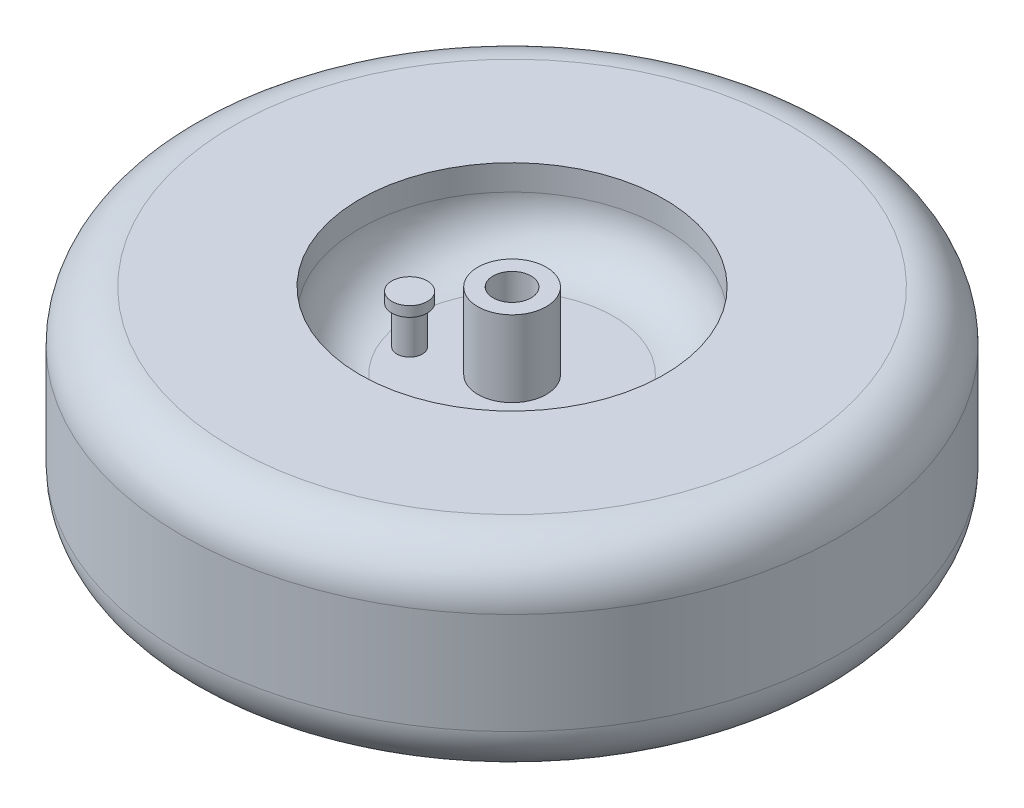
ISO-10303-21;
HEADER;
FILE_DESCRIPTION(('STEP AP214'),'2;1');
FILE_NAME('part.step','',(''),(''),'','','');
FILE_SCHEMA(('AUTOMOTIVE_DESIGN { 1 0 10303 214 1 1 1 1 }'));
ENDSEC;
DATA;
#1=APPLICATION_CONTEXT('core data for automotive mechanical design processes');
#2=APPLICATION_PROTOCOL_DEFINITION('international standard','automotive_design',2000,#1);
#3=PRODUCT_CONTEXT('',#1,'mechanical');
#4=PRODUCT('Part','Part','',(#3));
#5=PRODUCT_RELATED_PRODUCT_CATEGORY('part','',(#4));
#6=PRODUCT_DEFINITION_FORMATION('','',#4);
#7=PRODUCT_DEFINITION_CONTEXT('part definition',#1,'design');
#8=PRODUCT_DEFINITION('design','',#6,#7);
#9=PRODUCT_DEFINITION_SHAPE('','',#8);
#10=(LENGTH_UNIT() NAMED_UNIT(*) SI_UNIT(.MILLI.,.METRE.));
#11=(NAMED_UNIT(*) PLANE_ANGLE_UNIT() SI_UNIT($,.RADIAN.));
#12=(NAMED_UNIT(*) SI_UNIT($,.STERADIAN.) SOLID_ANGLE_UNIT());
#13=UNCERTAINTY_MEASURE_WITH_UNIT(LENGTH_MEASURE(1.E-05),#10,'distance_accuracy_value','');
#14=(GEOMETRIC_REPRESENTATION_CONTEXT(3) GLOBAL_UNCERTAINTY_ASSIGNED_CONTEXT((#13)) GLOBAL_UNIT_ASSIGNED_CONTEXT((#10,
#11,#12)) REPRESENTATION_CONTEXT('',''));
#15=CARTESIAN_POINT('',(0.,0.,0.));
#16=DIRECTION('',(0.,0.,1.));
#17=DIRECTION('',(1.,0.,0.));
#18=AXIS2_PLACEMENT_3D('',#15,#16,#17);
#19=CARTESIAN_POINT('',(0.,101.6,0.));
#20=DIRECTION('',(0.,-1.,0.));
#21=DIRECTION('',(0.,0.,-1.));
#22=AXIS2_PLACEMENT_3D('',#19,#20,#21);
#23=CYLINDRICAL_SURFACE('',#22,165.1);
#24=CARTESIAN_POINT('',(0.,25.4,0.));
#25=DIRECTION('',(0.,1.,0.));
#26=DIRECTION('',(0.,0.,1.));
#27=AXIS2_PLACEMENT_3D('',#24,#25,#26);
#28=CIRCLE('',#27,165.1);
#29=CARTESIAN_POINT('',(0.,25.4,165.1));
#30=VERTEX_POINT('',#29);
#31=EDGE_CURVE('E55',#30,#30,#28,.T.);
#32=ORIENTED_EDGE('',*,*,#31,.T.);
#33=EDGE_LOOP('',(#32));
#34=FACE_BOUND('',#33,.T.);
#35=CARTESIAN_POINT('',(0.,76.2,0.));
#36=DIRECTION('',(0.,1.,0.));
#37=DIRECTION('',(0.,0.,1.));
#38=AXIS2_PLACEMENT_3D('',#35,#36,#37);
#39=CIRCLE('',#38,165.1);
#40=CARTESIAN_POINT('',(0.,76.2,165.1));
#41=VERTEX_POINT('',#40);
#42=EDGE_CURVE('E71',#41,#41,#39,.F.);
#43=ORIENTED_EDGE('',*,*,#42,.T.);
#44=EDGE_LOOP('',(#43));
#45=FACE_BOUND('',#44,.T.);
#46=ADVANCED_FACE('F47',(#34,#45),#23,.T.);
#47=CARTESIAN_POINT('',(0.,101.6,0.));
#48=DIRECTION('',(0.,1.,0.));
#49=DIRECTION('',(0.,0.,1.));
#50=AXIS2_PLACEMENT_3D('',#47,#48,#49);
#51=PLANE('',#50);
#52=CARTESIAN_POINT('',(0.,101.6,0.));
#53=DIRECTION('',(0.,1.,0.));
#54=DIRECTION('',(0.,0.,1.));
#55=AXIS2_PLACEMENT_3D('',#52,#53,#54);
#56=CIRCLE('',#55,139.7);
#57=CARTESIAN_POINT('',(0.,101.6,139.7));
#58=VERTEX_POINT('',#57);
#59=EDGE_CURVE('E75',#58,#58,#56,.T.);
#60=ORIENTED_EDGE('',*,*,#59,.T.);
#61=EDGE_LOOP('',(#60));
#62=FACE_BOUND('',#61,.T.);
#63=CARTESIAN_POINT('',(0.,101.6,0.));
#64=DIRECTION('',(0.,1.,0.));
#65=DIRECTION('',(0.,0.,1.));
#66=AXIS2_PLACEMENT_3D('',#63,#64,#65);
#67=CIRCLE('',#66,76.2);
#68=CARTESIAN_POINT('',(0.,101.6,76.2));
#69=VERTEX_POINT('',#68);
#70=EDGE_CURVE('E87',#69,#69,#67,.T.);
#71=ORIENTED_EDGE('',*,*,#70,.F.);
#72=EDGE_LOOP('',(#71));
#73=FACE_BOUND('',#72,.T.);
#74=ADVANCED_FACE('F155',(#62,#73),#51,.T.);
#75=CARTESIAN_POINT('',(0.,0.,0.));
#76=DIRECTION('',(0.,1.,0.));
#77=DIRECTION('',(0.,0.,1.));
#78=AXIS2_PLACEMENT_3D('',#75,#76,#77);
#79=PLANE('',#78);
#80=CARTESIAN_POINT('',(0.,0.,0.));
#81=DIRECTION('',(0.,1.,0.));
#82=DIRECTION('',(0.,0.,1.));
#83=AXIS2_PLACEMENT_3D('',#80,#81,#82);
#84=CIRCLE('',#83,139.7);
#85=CARTESIAN_POINT('',(0.,0.,139.7));
#86=VERTEX_POINT('',#85);
#87=EDGE_CURVE('E10',#86,#86,#84,.F.);
#88=ORIENTED_EDGE('',*,*,#87,.T.);
#89=EDGE_LOOP('',(#88));
#90=FACE_BOUND('',#89,.T.);
#91=CARTESIAN_POINT('',(0.,0.,0.));
#92=DIRECTION('',(0.,-1.,0.));
#93=DIRECTION('',(0.,0.,-1.));
#94=AXIS2_PLACEMENT_3D('',#91,#92,#93);
#95=CIRCLE('',#94,76.2);
#96=CARTESIAN_POINT('',(0.,0.,-76.2));
#97=VERTEX_POINT('',#96);
#98=EDGE_CURVE('E91',#97,#97,#95,.T.);
#99=ORIENTED_EDGE('',*,*,#98,.F.);
#100=EDGE_LOOP('',(#99));
#101=FACE_BOUND('',#100,.T.);
#102=ADVANCED_FACE('F160',(#90,#101),#79,.F.);
#103=CARTESIAN_POINT('',(0.,63.5,0.));
#104=DIRECTION('',(0.,1.,0.));
#105=DIRECTION('',(0.,0.,1.));
#106=AXIS2_PLACEMENT_3D('',#103,#104,#105);
#107=CYLINDRICAL_SURFACE('',#106,76.2);
#108=CARTESIAN_POINT('',(0.,88.9,0.));
#109=DIRECTION('',(0.,1.,0.));
#110=DIRECTION('',(0.,0.,1.));
#111=AXIS2_PLACEMENT_3D('',#108,#109,#110);
#112=CIRCLE('',#111,76.2);
#113=CARTESIAN_POINT('',(0.,88.9,76.2));
#114=VERTEX_POINT('',#113);
#115=EDGE_CURVE('E79',#114,#114,#112,.F.);
#116=CARTESIAN_POINT('',(0.,88.9,76.2));
#117=CARTESIAN_POINT('',(0.,89.0322916666667,76.2));
#118=CARTESIAN_POINT('',(0.,89.1645833333333,76.2));
#119=CARTESIAN_POINT('',(0.,89.4291666666667,76.2));
#120=CARTESIAN_POINT('',(0.,89.5614583333333,76.2));
#121=CARTESIAN_POINT('',(0.,89.8260416666667,76.2));
#122=CARTESIAN_POINT('',(0.,89.9583333333333,76.2));
#123=CARTESIAN_POINT('',(0.,90.2229166666667,76.2));
#124=CARTESIAN_POINT('',(0.,90.3552083333333,76.2));
#125=CARTESIAN_POINT('',(0.,90.6197916666667,76.2));
#126=CARTESIAN_POINT('',(0.,90.7520833333333,76.2));
#127=CARTESIAN_POINT('',(0.,91.0166666666667,76.2));
#128=CARTESIAN_POINT('',(0.,91.1489583333333,76.2));
#129=CARTESIAN_POINT('',(0.,91.4135416666667,76.2));
#130=CARTESIAN_POINT('',(0.,91.5458333333333,76.2));
#131=CARTESIAN_POINT('',(0.,91.8104166666667,76.2));
#132=CARTESIAN_POINT('',(0.,91.9427083333333,76.2));
#133=CARTESIAN_POINT('',(0.,92.2072916666667,76.2));
#134=CARTESIAN_POINT('',(0.,92.3395833333333,76.2));
#135=CARTESIAN_POINT('',(0.,92.6041666666667,76.2));
#136=CARTESIAN_POINT('',(0.,92.7364583333333,76.2));
#137=CARTESIAN_POINT('',(0.,93.0010416666667,76.2));
#138=CARTESIAN_POINT('',(0.,93.1333333333333,76.2));
#139=CARTESIAN_POINT('',(0.,93.3979166666667,76.2));
#140=CARTESIAN_POINT('',(0.,93.5302083333333,76.2));
#141=CARTESIAN_POINT('',(0.,93.7947916666667,76.2));
#142=CARTESIAN_POINT('',(0.,93.9270833333333,76.2));
#143=CARTESIAN_POINT('',(0.,94.1916666666667,76.2));
#144=CARTESIAN_POINT('',(0.,94.3239583333333,76.2));
#145=CARTESIAN_POINT('',(0.,94.5885416666667,76.2));
#146=CARTESIAN_POINT('',(0.,94.7208333333333,76.2));
#147=CARTESIAN_POINT('',(0.,94.9854166666667,76.2));
#148=CARTESIAN_POINT('',(0.,95.1177083333333,76.2));
#149=CARTESIAN_POINT('',(0.,95.3822916666667,76.2));
#150=CARTESIAN_POINT('',(0.,95.5145833333333,76.2));
#151=CARTESIAN_POINT('',(0.,95.7791666666667,76.2));
#152=CARTESIAN_POINT('',(0.,95.9114583333333,76.2));
#153=CARTESIAN_POINT('',(0.,96.1760416666667,76.2));
#154=CARTESIAN_POINT('',(0.,96.3083333333333,76.2));
#155=CARTESIAN_POINT('',(0.,96.5729166666667,76.2));
#156=CARTESIAN_POINT('',(0.,96.7052083333333,76.2));
#157=CARTESIAN_POINT('',(0.,96.9697916666667,76.2));
#158=CARTESIAN_POINT('',(0.,97.1020833333333,76.2));
#159=CARTESIAN_POINT('',(0.,97.3666666666667,76.2));
#160=CARTESIAN_POINT('',(0.,97.4989583333333,76.2));
#161=CARTESIAN_POINT('',(0.,97.7635416666667,76.2));
#162=CARTESIAN_POINT('',(0.,97.8958333333333,76.2));
#163=CARTESIAN_POINT('',(0.,98.1604166666666,76.2));
#164=CARTESIAN_POINT('',(0.,98.2927083333333,76.2));
#165=CARTESIAN_POINT('',(0.,98.5572916666667,76.2));
#166=CARTESIAN_POINT('',(0.,98.6895833333333,76.2));
#167=CARTESIAN_POINT('',(0.,98.9541666666667,76.2));
#168=CARTESIAN_POINT('',(0.,99.0864583333333,76.2));
#169=CARTESIAN_POINT('',(0.,99.3510416666667,76.2));
#170=CARTESIAN_POINT('',(0.,99.4833333333333,76.2));
#171=CARTESIAN_POINT('',(0.,99.7479166666667,76.2));
#172=CARTESIAN_POINT('',(0.,99.8802083333333,76.2));
#173=CARTESIAN_POINT('',(0.,100.144791666667,76.2));
#174=CARTESIAN_POINT('',(0.,100.277083333333,76.2));
#175=CARTESIAN_POINT('',(0.,100.541666666667,76.2));
#176=CARTESIAN_POINT('',(0.,100.673958333333,76.2));
#177=CARTESIAN_POINT('',(0.,100.938541666667,76.2));
#178=CARTESIAN_POINT('',(0.,101.070833333333,76.2));
#179=CARTESIAN_POINT('',(0.,101.335416666667,76.2));
#180=CARTESIAN_POINT('',(0.,101.467708333333,76.2));
#181=CARTESIAN_POINT('',(0.,101.6,76.2));
#182=B_SPLINE_CURVE_WITH_KNOTS('',3,(#116,#117,#118,#119,#120,#121,#122,#123,#124,#125,#126,
#127,#128,#129,#130,#131,#132,#133,#134,#135,#136,#137,#138,#139,#140,#141,#142,#143,#144,#145,
#146,#147,#148,#149,#150,#151,#152,#153,#154,#155,#156,#157,#158,#159,#160,#161,#162,#163,#164,
#165,#166,#167,#168,#169,#170,#171,#172,#173,#174,#175,#176,#177,#178,#179,#180,#181),
.UNSPECIFIED.,.F.,.F.,(4,2,2,2,2,2,2,2,2,2,2,2,2,2,2,2,2,2,2,2,2,2,2,2,2,2,2,2,2,2,2,2,4),(0.,
0.396875000000005,0.793749999999996,1.190625,1.58750000000001,1.984375,2.38125,2.77812500000001,
3.175,3.571875,3.96875000000001,4.365625,4.7625,5.15937500000001,5.55625,5.95312499999999,
6.35000000000001,6.746875,7.14374999999999,7.540625,7.9375,8.33437499999999,8.73125,9.128125,
9.52499999999999,9.921875,10.31875,10.715625,11.1125,11.509375,11.90625,12.303125,12.7),.UNSPECIFIED.);
#183=EDGE_CURVE('BSEAM198',#114,#69,#182,.T.);
#184=ORIENTED_EDGE('',*,*,#115,.T.);
#185=ORIENTED_EDGE('',*,*,#70,.T.);
#186=ORIENTED_EDGE('',*,*,#183,.T.);
#187=ORIENTED_EDGE('',*,*,#183,.F.);
#188=EDGE_LOOP('',(#184,#186,#185,#187));
#189=FACE_BOUND('',#188,.T.);
#190=ADVANCED_FACE('F198',(#189),#107,.F.);
#191=CARTESIAN_POINT('',(0.,63.5,0.));
#192=DIRECTION('',(0.,1.,0.));
#193=DIRECTION('',(0.,0.,1.));
#194=AXIS2_PLACEMENT_3D('',#191,#192,#193);
#195=PLANE('',#194);
#196=CARTESIAN_POINT('',(-37.7856482065795,63.5,13.5479196487154));
#197=DIRECTION('',(0.,1.,0.));
#198=DIRECTION('',(0.,0.,1.));
#199=AXIS2_PLACEMENT_3D('',#196,#197,#198);
#200=CIRCLE('',#199,6.35);
#201=CARTESIAN_POINT('',(-37.7856482065795,63.5,7.19791964871538));
#202=VERTEX_POINT('',#201);
#203=EDGE_CURVE('E120',#202,#202,#200,.T.);
#204=ORIENTED_EDGE('',*,*,#203,.F.);
#205=EDGE_LOOP('',(#204));
#206=FACE_BOUND('',#205,.T.);
#207=CARTESIAN_POINT('',(0.,63.5,0.));
#208=DIRECTION('',(0.,1.,0.));
#209=DIRECTION('',(0.,0.,1.));
#210=AXIS2_PLACEMENT_3D('',#207,#208,#209);
#211=CIRCLE('',#210,17.145);
#212=CARTESIAN_POINT('',(0.,63.5,-17.145));
#213=VERTEX_POINT('',#212);
#214=EDGE_CURVE('E104',#213,#213,#211,.T.);
#215=ORIENTED_EDGE('',*,*,#214,.F.);
#216=EDGE_LOOP('',(#215));
#217=FACE_BOUND('',#216,.T.);
#218=CARTESIAN_POINT('',(0.,63.5,0.));
#219=DIRECTION('',(0.,1.,0.));
#220=DIRECTION('',(0.,0.,1.));
#221=AXIS2_PLACEMENT_3D('',#218,#219,#220);
#222=CIRCLE('',#221,50.8);
#223=CARTESIAN_POINT('',(0.,63.5,50.8));
#224=VERTEX_POINT('',#223);
#225=EDGE_CURVE('E83',#224,#224,#222,.T.);
#226=ORIENTED_EDGE('',*,*,#225,.T.);
#227=EDGE_LOOP('',(#226));
#228=FACE_BOUND('',#227,.T.);
#229=ADVANCED_FACE('F170',(#206,#217,#228),#195,.T.);
#230=CARTESIAN_POINT('',(0.,88.9,0.));
#231=DIRECTION('',(0.,1.,0.));
#232=DIRECTION('',(0.,0.,1.));
#233=AXIS2_PLACEMENT_3D('',#230,#231,#232);
#234=TOROIDAL_SURFACE('',#233,50.8,25.4);
#235=ORIENTED_EDGE('',*,*,#115,.F.);
#236=EDGE_LOOP('',(#235));
#237=FACE_BOUND('',#236,.T.);
#238=ORIENTED_EDGE('',*,*,#225,.F.);
#239=EDGE_LOOP('',(#238));
#240=FACE_BOUND('',#239,.T.);
#241=ADVANCED_FACE('F166',(#237,#240),#234,.F.);
#242=CARTESIAN_POINT('',(0.,76.2,0.));
#243=DIRECTION('',(0.,1.,0.));
#244=DIRECTION('',(0.,0.,1.));
#245=AXIS2_PLACEMENT_3D('',#242,#243,#244);
#246=TOROIDAL_SURFACE('',#245,139.7,25.4);
#247=ORIENTED_EDGE('',*,*,#42,.F.);
#248=EDGE_LOOP('',(#247));
#249=FACE_BOUND('',#248,.T.);
#250=ORIENTED_EDGE('',*,*,#59,.F.);
#251=EDGE_LOOP('',(#250));
#252=FACE_BOUND('',#251,.T.);
#253=ADVANCED_FACE('F169',(#249,#252),#246,.T.);
#254=CARTESIAN_POINT('',(0.,38.1,0.));
#255=DIRECTION('',(0.,-1.,0.));
#256=DIRECTION('',(0.,0.,-1.));
#257=AXIS2_PLACEMENT_3D('',#254,#255,#256);
#258=CYLINDRICAL_SURFACE('',#257,76.2);
#259=CARTESIAN_POINT('',(0.,12.7,0.));
#260=DIRECTION('',(0.,-1.,0.));
#261=DIRECTION('',(0.,0.,-1.));
#262=AXIS2_PLACEMENT_3D('',#259,#260,#261);
#263=CIRCLE('',#262,76.2);
#264=CARTESIAN_POINT('',(0.,12.7,-76.2));
#265=VERTEX_POINT('',#264);
#266=EDGE_CURVE('E60',#265,#265,#263,.F.);
#267=CARTESIAN_POINT('',(0.,12.7,-76.2));
#268=CARTESIAN_POINT('',(0.,12.5677083333333,-76.2));
#269=CARTESIAN_POINT('',(0.,12.4354166666667,-76.2));
#270=CARTESIAN_POINT('',(0.,12.1708333333333,-76.2));
#271=CARTESIAN_POINT('',(0.,12.0385416666667,-76.2));
#272=CARTESIAN_POINT('',(0.,11.7739583333333,-76.2));
#273=CARTESIAN_POINT('',(0.,11.6416666666667,-76.2));
#274=CARTESIAN_POINT('',(0.,11.3770833333333,-76.2));
#275=CARTESIAN_POINT('',(0.,11.2447916666667,-76.2));
#276=CARTESIAN_POINT('',(0.,10.9802083333333,-76.2));
#277=CARTESIAN_POINT('',(0.,10.8479166666667,-76.2));
#278=CARTESIAN_POINT('',(0.,10.5833333333333,-76.2));
#279=CARTESIAN_POINT('',(0.,10.4510416666667,-76.2));
#280=CARTESIAN_POINT('',(0.,10.1864583333333,-76.2));
#281=CARTESIAN_POINT('',(0.,10.0541666666667,-76.2));
#282=CARTESIAN_POINT('',(0.,9.78958333333333,-76.2));
#283=CARTESIAN_POINT('',(0.,9.65729166666667,-76.2));
#284=CARTESIAN_POINT('',(0.,9.39270833333333,-76.2));
#285=CARTESIAN_POINT('',(0.,9.26041666666666,-76.2));
#286=CARTESIAN_POINT('',(0.,8.99583333333333,-76.2));
#287=CARTESIAN_POINT('',(0.,8.86354166666666,-76.2));
#288=CARTESIAN_POINT('',(0.,8.59895833333333,-76.2));
#289=CARTESIAN_POINT('',(0.,8.46666666666667,-76.2));
#290=CARTESIAN_POINT('',(0.,8.20208333333333,-76.2));
#291=CARTESIAN_POINT('',(0.,8.06979166666666,-76.2));
#292=CARTESIAN_POINT('',(0.,7.80520833333333,-76.2));
#293=CARTESIAN_POINT('',(0.,7.67291666666666,-76.2));
#294=CARTESIAN_POINT('',(0.,7.40833333333333,-76.2));
#295=CARTESIAN_POINT('',(0.,7.27604166666666,-76.2));
#296=CARTESIAN_POINT('',(0.,7.01145833333333,-76.2));
#297=CARTESIAN_POINT('',(0.,6.87916666666667,-76.2));
#298=CARTESIAN_POINT('',(0.,6.61458333333333,-76.2));
#299=CARTESIAN_POINT('',(0.,6.48229166666667,-76.2));
#300=CARTESIAN_POINT('',(0.,6.21770833333334,-76.2));
#301=CARTESIAN_POINT('',(0.,6.08541666666667,-76.2));
#302=CARTESIAN_POINT('',(0.,5.82083333333333,-76.2));
#303=CARTESIAN_POINT('',(0.,5.68854166666667,-76.2));
#304=CARTESIAN_POINT('',(0.,5.42395833333333,-76.2));
#305=CARTESIAN_POINT('',(0.,5.29166666666667,-76.2));
#306=CARTESIAN_POINT('',(0.,5.02708333333333,-76.2));
#307=CARTESIAN_POINT('',(0.,4.89479166666667,-76.2));
#308=CARTESIAN_POINT('',(0.,4.63020833333333,-76.2));
#309=CARTESIAN_POINT('',(0.,4.49791666666667,-76.2));
#310=CARTESIAN_POINT('',(0.,4.23333333333333,-76.2));
#311=CARTESIAN_POINT('',(0.,4.10104166666667,-76.2));
#312=CARTESIAN_POINT('',(0.,3.83645833333333,-76.2));
#313=CARTESIAN_POINT('',(0.,3.70416666666667,-76.2));
#314=CARTESIAN_POINT('',(0.,3.43958333333333,-76.2));
#315=CARTESIAN_POINT('',(0.,3.30729166666667,-76.2));
#316=CARTESIAN_POINT('',(0.,3.04270833333333,-76.2));
#317=CARTESIAN_POINT('',(0.,2.91041666666667,-76.2));
#318=CARTESIAN_POINT('',(0.,2.64583333333333,-76.2));
#319=CARTESIAN_POINT('',(0.,2.51354166666667,-76.2));
#320=CARTESIAN_POINT('',(0.,2.24895833333333,-76.2));
#321=CARTESIAN_POINT('',(0.,2.11666666666666,-76.2));
#322=CARTESIAN_POINT('',(0.,1.85208333333333,-76.2));
#323=CARTESIAN_POINT('',(0.,1.71979166666666,-76.2));
#324=CARTESIAN_POINT('',(0.,1.45520833333333,-76.2));
#325=CARTESIAN_POINT('',(0.,1.32291666666667,-76.2));
#326=CARTESIAN_POINT('',(0.,1.05833333333333,-76.2));
#327=CARTESIAN_POINT('',(0.,0.926041666666664,-76.2));
#328=CARTESIAN_POINT('',(0.,0.66145833333333,-76.2));
#329=CARTESIAN_POINT('',(0.,0.529166666666664,-76.2));
#330=CARTESIAN_POINT('',(0.,0.264583333333332,-76.2));
#331=CARTESIAN_POINT('',(0.,0.132291666666666,-76.2));
#332=CARTESIAN_POINT('',(0.,0.,-76.2));
#333=B_SPLINE_CURVE_WITH_KNOTS('',3,(#267,#268,#269,#270,#271,#272,#273,#274,#275,#276,#277,
#278,#279,#280,#281,#282,#283,#284,#285,#286,#287,#288,#289,#290,#291,#292,#293,#294,#295,#296,
#297,#298,#299,#300,#301,#302,#303,#304,#305,#306,#307,#308,#309,#310,#311,#312,#313,#314,#315,
#316,#317,#318,#319,#320,#321,#322,#323,#324,#325,#326,#327,#328,#329,#330,#331,#332),
.UNSPECIFIED.,.F.,.F.,(4,2,2,2,2,2,2,2,2,2,2,2,2,2,2,2,2,2,2,2,2,2,2,2,2,2,2,2,2,2,2,2,4),(0.,
0.396875000000001,0.793749999999999,1.190625,1.5875,1.984375,2.38125,2.778125,3.175,3.571875,
3.96875,4.365625,4.7625,5.159375,5.55625,5.953125,6.35,6.746875,7.14375,7.540625,7.9375,
8.334375,8.73125,9.128125,9.525,9.921875,10.31875,10.715625,11.1125,11.509375,11.90625,
12.303125,12.7),.UNSPECIFIED.);
#334=EDGE_CURVE('BSEAM173',#265,#97,#333,.T.);
#335=ORIENTED_EDGE('',*,*,#266,.T.);
#336=ORIENTED_EDGE('',*,*,#98,.T.);
#337=ORIENTED_EDGE('',*,*,#334,.T.);
#338=ORIENTED_EDGE('',*,*,#334,.F.);
#339=EDGE_LOOP('',(#335,#337,#336,#338));
#340=FACE_BOUND('',#339,.T.);
#341=ADVANCED_FACE('F173',(#340),#258,.F.);
#342=CARTESIAN_POINT('',(0.,38.1,0.));
#343=DIRECTION('',(0.,-1.,0.));
#344=DIRECTION('',(0.,0.,-1.));
#345=AXIS2_PLACEMENT_3D('',#342,#343,#344);
#346=PLANE('',#345);
#347=CARTESIAN_POINT('',(0.,38.1,0.));
#348=DIRECTION('',(0.,-1.,0.));
#349=DIRECTION('',(0.,0.,-1.));
#350=AXIS2_PLACEMENT_3D('',#347,#348,#349);
#351=CIRCLE('',#350,17.145);
#352=CARTESIAN_POINT('',(0.,38.1,17.145));
#353=VERTEX_POINT('',#352);
#354=EDGE_CURVE('E96',#353,#353,#351,.T.);
#355=ORIENTED_EDGE('',*,*,#354,.F.);
#356=EDGE_LOOP('',(#355));
#357=FACE_BOUND('',#356,.T.);
#358=CARTESIAN_POINT('',(0.,38.1,0.));
#359=DIRECTION('',(0.,-1.,0.));
#360=DIRECTION('',(0.,0.,-1.));
#361=AXIS2_PLACEMENT_3D('',#358,#359,#360);
#362=CIRCLE('',#361,50.8);
#363=CARTESIAN_POINT('',(0.,38.1,-50.8));
#364=VERTEX_POINT('',#363);
#365=EDGE_CURVE('E65',#364,#364,#362,.T.);
#366=ORIENTED_EDGE('',*,*,#365,.T.);
#367=EDGE_LOOP('',(#366));
#368=FACE_BOUND('',#367,.T.);
#369=ADVANCED_FACE('F177',(#357,#368),#346,.T.);
#370=CARTESIAN_POINT('',(0.,12.7,0.));
#371=DIRECTION('',(0.,-1.,0.));
#372=DIRECTION('',(0.,0.,-1.));
#373=AXIS2_PLACEMENT_3D('',#370,#371,#372);
#374=TOROIDAL_SURFACE('',#373,50.8,25.4);
#375=ORIENTED_EDGE('',*,*,#266,.F.);
#376=EDGE_LOOP('',(#375));
#377=FACE_BOUND('',#376,.T.);
#378=ORIENTED_EDGE('',*,*,#365,.F.);
#379=EDGE_LOOP('',(#378));
#380=FACE_BOUND('',#379,.T.);
#381=ADVANCED_FACE('F175',(#377,#380),#374,.F.);
#382=CARTESIAN_POINT('',(0.,25.4,0.));
#383=DIRECTION('',(0.,1.,0.));
#384=DIRECTION('',(0.,0.,1.));
#385=AXIS2_PLACEMENT_3D('',#382,#383,#384);
#386=TOROIDAL_SURFACE('',#385,139.7,25.4);
#387=ORIENTED_EDGE('',*,*,#87,.F.);
#388=EDGE_LOOP('',(#387));
#389=FACE_BOUND('',#388,.T.);
#390=ORIENTED_EDGE('',*,*,#31,.F.);
#391=EDGE_LOOP('',(#390));
#392=FACE_BOUND('',#391,.T.);
#393=ADVANCED_FACE('F49',(#389,#392),#386,.T.);
#394=CARTESIAN_POINT('',(0.,0.,0.));
#395=DIRECTION('',(0.,1.,0.));
#396=DIRECTION('',(0.,0.,1.));
#397=AXIS2_PLACEMENT_3D('',#394,#395,#396);
#398=CYLINDRICAL_SURFACE('',#397,17.145);
#399=CARTESIAN_POINT('',(0.,0.,0.));
#400=DIRECTION('',(0.,-1.,0.));
#401=DIRECTION('',(0.,0.,-1.));
#402=AXIS2_PLACEMENT_3D('',#399,#400,#401);
#403=CIRCLE('',#402,17.145);
#404=CARTESIAN_POINT('',(0.,0.,17.145));
#405=VERTEX_POINT('',#404);
#406=EDGE_CURVE('E95',#405,#405,#403,.T.);
#407=CARTESIAN_POINT('',(0.,0.,17.145));
#408=CARTESIAN_POINT('',(0.,0.396875,17.145));
#409=CARTESIAN_POINT('',(0.,0.79375,17.145));
#410=CARTESIAN_POINT('',(0.,1.5875,17.145));
#411=CARTESIAN_POINT('',(0.,1.984375,17.145));
#412=CARTESIAN_POINT('',(0.,2.778125,17.145));
#413=CARTESIAN_POINT('',(0.,3.175,17.145));
#414=CARTESIAN_POINT('',(0.,3.96875,17.145));
#415=CARTESIAN_POINT('',(0.,4.365625,17.145));
#416=CARTESIAN_POINT('',(0.,5.159375,17.145));
#417=CARTESIAN_POINT('',(0.,5.55625,17.145));
#418=CARTESIAN_POINT('',(0.,6.35,17.145));
#419=CARTESIAN_POINT('',(0.,6.746875,17.145));
#420=CARTESIAN_POINT('',(0.,7.540625,17.145));
#421=CARTESIAN_POINT('',(0.,7.9375,17.145));
#422=CARTESIAN_POINT('',(0.,8.73125,17.145));
#423=CARTESIAN_POINT('',(0.,9.128125,17.145));
#424=CARTESIAN_POINT('',(0.,9.921875,17.145));
#425=CARTESIAN_POINT('',(0.,10.31875,17.145));
#426=CARTESIAN_POINT('',(0.,11.1125,17.145));
#427=CARTESIAN_POINT('',(0.,11.509375,17.145));
#428=CARTESIAN_POINT('',(0.,12.303125,17.145));
#429=CARTESIAN_POINT('',(0.,12.7,17.145));
#430=CARTESIAN_POINT('',(0.,13.49375,17.145));
#431=CARTESIAN_POINT('',(0.,13.890625,17.145));
#432=CARTESIAN_POINT('',(0.,14.684375,17.145));
#433=CARTESIAN_POINT('',(0.,15.08125,17.145));
#434=CARTESIAN_POINT('',(0.,15.875,17.145));
#435=CARTESIAN_POINT('',(0.,16.271875,17.145));
#436=CARTESIAN_POINT('',(0.,17.065625,17.145));
#437=CARTESIAN_POINT('',(0.,17.4625,17.145));
#438=CARTESIAN_POINT('',(0.,18.25625,17.145));
#439=CARTESIAN_POINT('',(0.,18.653125,17.145));
#440=CARTESIAN_POINT('',(0.,19.446875,17.145));
#441=CARTESIAN_POINT('',(0.,19.84375,17.145));
#442=CARTESIAN_POINT('',(0.,20.6375,17.145));
#443=CARTESIAN_POINT('',(0.,21.034375,17.145));
#444=CARTESIAN_POINT('',(0.,21.828125,17.145));
#445=CARTESIAN_POINT('',(0.,22.225,17.145));
#446=CARTESIAN_POINT('',(0.,23.01875,17.145));
#447=CARTESIAN_POINT('',(0.,23.415625,17.145));
#448=CARTESIAN_POINT('',(0.,24.209375,17.145));
#449=CARTESIAN_POINT('',(0.,24.60625,17.145));
#450=CARTESIAN_POINT('',(0.,25.4,17.145));
#451=CARTESIAN_POINT('',(0.,25.796875,17.145));
#452=CARTESIAN_POINT('',(0.,26.590625,17.145));
#453=CARTESIAN_POINT('',(0.,26.9875,17.145));
#454=CARTESIAN_POINT('',(0.,27.78125,17.145));
#455=CARTESIAN_POINT('',(0.,28.178125,17.145));
#456=CARTESIAN_POINT('',(0.,28.971875,17.145));
#457=CARTESIAN_POINT('',(0.,29.36875,17.145));
#458=CARTESIAN_POINT('',(0.,30.1625,17.145));
#459=CARTESIAN_POINT('',(0.,30.559375,17.145));
#460=CARTESIAN_POINT('',(0.,31.353125,17.145));
#461=CARTESIAN_POINT('',(0.,31.75,17.145));
#462=CARTESIAN_POINT('',(0.,32.54375,17.145));
#463=CARTESIAN_POINT('',(0.,32.940625,17.145));
#464=CARTESIAN_POINT('',(0.,33.734375,17.145));
#465=CARTESIAN_POINT('',(0.,34.13125,17.145));
#466=CARTESIAN_POINT('',(0.,34.925,17.145));
#467=CARTESIAN_POINT('',(0.,35.321875,17.145));
#468=CARTESIAN_POINT('',(0.,36.115625,17.145));
#469=CARTESIAN_POINT('',(0.,36.5125,17.145));
#470=CARTESIAN_POINT('',(0.,37.30625,17.145));
#471=CARTESIAN_POINT('',(0.,37.703125,17.145));
#472=CARTESIAN_POINT('',(0.,38.1,17.145));
#473=B_SPLINE_CURVE_WITH_KNOTS('',3,(#407,#408,#409,#410,#411,#412,#413,#414,#415,#416,#417,
#418,#419,#420,#421,#422,#423,#424,#425,#426,#427,#428,#429,#430,#431,#432,#433,#434,#435,#436,
#437,#438,#439,#440,#441,#442,#443,#444,#445,#446,#447,#448,#449,#450,#451,#452,#453,#454,#455,
#456,#457,#458,#459,#460,#461,#462,#463,#464,#465,#466,#467,#468,#469,#470,#471,#472),
.UNSPECIFIED.,.F.,.F.,(4,2,2,2,2,2,2,2,2,2,2,2,2,2,2,2,2,2,2,2,2,2,2,2,2,2,2,2,2,2,2,2,4),(0.,
1.190625,2.38125,3.571875,4.7625,5.953125,7.14375,8.334375,9.525,10.715625,11.90625,13.096875,
14.2875,15.478125,16.66875,17.859375,19.05,20.240625,21.43125,22.621875,23.8125,25.003125,
26.19375,27.384375,28.575,29.765625,30.95625,32.146875,33.3375,34.528125,35.71875,36.909375,
38.1),.UNSPECIFIED.);
#474=EDGE_CURVE('BSEAM183',#405,#353,#473,.T.);
#475=ORIENTED_EDGE('',*,*,#406,.F.);
#476=ORIENTED_EDGE('',*,*,#354,.T.);
#477=ORIENTED_EDGE('',*,*,#474,.T.);
#478=ORIENTED_EDGE('',*,*,#474,.F.);
#479=EDGE_LOOP('',(#475,#477,#476,#478));
#480=FACE_BOUND('',#479,.T.);
#481=ADVANCED_FACE('F183',(#480),#398,.T.);
#482=CARTESIAN_POINT('',(0.,0.,0.));
#483=DIRECTION('',(0.,-1.,0.));
#484=DIRECTION('',(0.,0.,-1.));
#485=AXIS2_PLACEMENT_3D('',#482,#483,#484);
#486=PLANE('',#485);
#487=CARTESIAN_POINT('',(0.,0.,0.));
#488=DIRECTION('',(0.,1.,0.));
#489=DIRECTION('',(0.,0.,1.));
#490=AXIS2_PLACEMENT_3D('',#487,#488,#489);
#491=CIRCLE('',#490,9.52500000000001);
#492=CARTESIAN_POINT('',(0.,0.,9.52500000000001));
#493=VERTEX_POINT('',#492);
#494=EDGE_CURVE('E108',#493,#493,#491,.T.);
#495=ORIENTED_EDGE('',*,*,#494,.T.);
#496=EDGE_LOOP('',(#495));
#497=FACE_BOUND('',#496,.T.);
#498=ORIENTED_EDGE('',*,*,#406,.T.);
#499=EDGE_LOOP('',(#498));
#500=FACE_BOUND('',#499,.T.);
#501=ADVANCED_FACE('F213',(#497,#500),#486,.T.);
#502=CARTESIAN_POINT('',(0.,101.6,0.));
#503=DIRECTION('',(0.,-1.,0.));
#504=DIRECTION('',(0.,0.,-1.));
#505=AXIS2_PLACEMENT_3D('',#502,#503,#504);
#506=CYLINDRICAL_SURFACE('',#505,17.145);
#507=CARTESIAN_POINT('',(0.,101.6,0.));
#508=DIRECTION('',(0.,1.,0.));
#509=DIRECTION('',(0.,0.,1.));
#510=AXIS2_PLACEMENT_3D('',#507,#508,#509);
#511=CIRCLE('',#510,17.145);
#512=CARTESIAN_POINT('',(0.,101.6,-17.145));
#513=VERTEX_POINT('',#512);
#514=EDGE_CURVE('E100',#513,#513,#511,.T.);
#515=CARTESIAN_POINT('',(0.,101.6,-17.145));
#516=CARTESIAN_POINT('',(0.,101.203125,-17.145));
#517=CARTESIAN_POINT('',(0.,100.80625,-17.145));
#518=CARTESIAN_POINT('',(0.,100.0125,-17.145));
#519=CARTESIAN_POINT('',(0.,99.615625,-17.145));
#520=CARTESIAN_POINT('',(0.,98.821875,-17.145));
#521=CARTESIAN_POINT('',(0.,98.425,-17.145));
#522=CARTESIAN_POINT('',(0.,97.63125,-17.145));
#523=CARTESIAN_POINT('',(0.,97.234375,-17.145));
#524=CARTESIAN_POINT('',(0.,96.440625,-17.145));
#525=CARTESIAN_POINT('',(0.,96.04375,-17.145));
#526=CARTESIAN_POINT('',(0.,95.25,-17.145));
#527=CARTESIAN_POINT('',(0.,94.853125,-17.145));
#528=CARTESIAN_POINT('',(0.,94.059375,-17.145));
#529=CARTESIAN_POINT('',(0.,93.6625,-17.145));
#530=CARTESIAN_POINT('',(0.,92.86875,-17.145));
#531=CARTESIAN_POINT('',(0.,92.471875,-17.145));
#532=CARTESIAN_POINT('',(0.,91.678125,-17.145));
#533=CARTESIAN_POINT('',(0.,91.28125,-17.145));
#534=CARTESIAN_POINT('',(0.,90.4875,-17.145));
#535=CARTESIAN_POINT('',(0.,90.090625,-17.145));
#536=CARTESIAN_POINT('',(0.,89.296875,-17.145));
#537=CARTESIAN_POINT('',(0.,88.9,-17.145));
#538=CARTESIAN_POINT('',(0.,88.10625,-17.145));
#539=CARTESIAN_POINT('',(0.,87.709375,-17.145));
#540=CARTESIAN_POINT('',(0.,86.915625,-17.145));
#541=CARTESIAN_POINT('',(0.,86.51875,-17.145));
#542=CARTESIAN_POINT('',(0.,85.725,-17.145));
#543=CARTESIAN_POINT('',(0.,85.328125,-17.145));
#544=CARTESIAN_POINT('',(0.,84.534375,-17.145));
#545=CARTESIAN_POINT('',(0.,84.1375,-17.145));
#546=CARTESIAN_POINT('',(0.,83.34375,-17.145));
#547=CARTESIAN_POINT('',(0.,82.946875,-17.145));
#548=CARTESIAN_POINT('',(0.,82.153125,-17.145));
#549=CARTESIAN_POINT('',(0.,81.75625,-17.145));
#550=CARTESIAN_POINT('',(0.,80.9625,-17.145));
#551=CARTESIAN_POINT('',(0.,80.565625,-17.145));
#552=CARTESIAN_POINT('',(0.,79.771875,-17.145));
#553=CARTESIAN_POINT('',(0.,79.375,-17.145));
#554=CARTESIAN_POINT('',(0.,78.58125,-17.145));
#555=CARTESIAN_POINT('',(0.,78.184375,-17.145));
#556=CARTESIAN_POINT('',(0.,77.390625,-17.145));
#557=CARTESIAN_POINT('',(0.,76.99375,-17.145));
#558=CARTESIAN_POINT('',(0.,76.2,-17.145));
#559=CARTESIAN_POINT('',(0.,75.803125,-17.145));
#560=CARTESIAN_POINT('',(0.,75.009375,-17.145));
#561=CARTESIAN_POINT('',(0.,74.6125,-17.145));
#562=CARTESIAN_POINT('',(0.,73.81875,-17.145));
#563=CARTESIAN_POINT('',(0.,73.421875,-17.145));
#564=CARTESIAN_POINT('',(0.,72.628125,-17.145));
#565=CARTESIAN_POINT('',(0.,72.23125,-17.145));
#566=CARTESIAN_POINT('',(0.,71.4375,-17.145));
#567=CARTESIAN_POINT('',(0.,71.040625,-17.145));
#568=CARTESIAN_POINT('',(0.,70.246875,-17.145));
#569=CARTESIAN_POINT('',(0.,69.85,-17.145));
#570=CARTESIAN_POINT('',(0.,69.05625,-17.145));
#571=CARTESIAN_POINT('',(0.,68.659375,-17.145));
#572=CARTESIAN_POINT('',(0.,67.865625,-17.145));
#573=CARTESIAN_POINT('',(0.,67.46875,-17.145));
#574=CARTESIAN_POINT('',(0.,66.675,-17.145));
#575=CARTESIAN_POINT('',(0.,66.278125,-17.145));
#576=CARTESIAN_POINT('',(0.,65.484375,-17.145));
#577=CARTESIAN_POINT('',(0.,65.0875,-17.145));
#578=CARTESIAN_POINT('',(0.,64.29375,-17.145));
#579=CARTESIAN_POINT('',(0.,63.896875,-17.145));
#580=CARTESIAN_POINT('',(0.,63.5,-17.145));
#581=B_SPLINE_CURVE_WITH_KNOTS('',3,(#515,#516,#517,#518,#519,#520,#521,#522,#523,#524,#525,
#526,#527,#528,#529,#530,#531,#532,#533,#534,#535,#536,#537,#538,#539,#540,#541,#542,#543,#544,
#545,#546,#547,#548,#549,#550,#551,#552,#553,#554,#555,#556,#557,#558,#559,#560,#561,#562,#563,
#564,#565,#566,#567,#568,#569,#570,#571,#572,#573,#574,#575,#576,#577,#578,#579,#580),
.UNSPECIFIED.,.F.,.F.,(4,2,2,2,2,2,2,2,2,2,2,2,2,2,2,2,2,2,2,2,2,2,2,2,2,2,2,2,2,2,2,2,4),(0.,
1.190625,2.38125,3.571875,4.7625,5.953125,7.14375,8.334375,9.52500000000001,10.715625,11.90625,
13.096875,14.2875,15.478125,16.66875,17.859375,19.05,20.240625,21.43125,22.621875,23.8125,
25.003125,26.19375,27.384375,28.575,29.765625,30.95625,32.146875,33.3375,34.528125,35.71875,
36.909375,38.1),.UNSPECIFIED.);
#582=EDGE_CURVE('BSEAM217',#513,#213,#581,.T.);
#583=ORIENTED_EDGE('',*,*,#514,.F.);
#584=ORIENTED_EDGE('',*,*,#214,.T.);
#585=ORIENTED_EDGE('',*,*,#582,.T.);
#586=ORIENTED_EDGE('',*,*,#582,.F.);
#587=EDGE_LOOP('',(#583,#585,#584,#586));
#588=FACE_BOUND('',#587,.T.);
#589=ADVANCED_FACE('F217',(#588),#506,.T.);
#590=CARTESIAN_POINT('',(0.,101.6,0.));
#591=DIRECTION('',(0.,1.,0.));
#592=DIRECTION('',(0.,0.,1.));
#593=AXIS2_PLACEMENT_3D('',#590,#591,#592);
#594=PLANE('',#593);
#595=CARTESIAN_POINT('',(0.,101.6,0.));
#596=DIRECTION('',(0.,1.,0.));
#597=DIRECTION('',(0.,0.,1.));
#598=AXIS2_PLACEMENT_3D('',#595,#596,#597);
#599=CIRCLE('',#598,9.52500000000001);
#600=CARTESIAN_POINT('',(0.,101.6,9.52500000000001));
#601=VERTEX_POINT('',#600);
#602=EDGE_CURVE('E112',#601,#601,#599,.T.);
#603=ORIENTED_EDGE('',*,*,#602,.F.);
#604=EDGE_LOOP('',(#603));
#605=FACE_BOUND('',#604,.T.);
#606=ORIENTED_EDGE('',*,*,#514,.T.);
#607=EDGE_LOOP('',(#606));
#608=FACE_BOUND('',#607,.T.);
#609=ADVANCED_FACE('F221',(#605,#608),#594,.T.);
#610=CARTESIAN_POINT('',(0.,0.,0.));
#611=DIRECTION('',(0.,1.,0.));
#612=DIRECTION('',(0.,0.,1.));
#613=AXIS2_PLACEMENT_3D('',#610,#611,#612);
#614=CYLINDRICAL_SURFACE('',#613,9.52500000000001);
#615=ORIENTED_EDGE('',*,*,#494,.F.);
#616=EDGE_LOOP('',(#615));
#617=FACE_BOUND('',#616,.T.);
#618=ORIENTED_EDGE('',*,*,#602,.T.);
#619=EDGE_LOOP('',(#618));
#620=FACE_BOUND('',#619,.T.);
#621=ADVANCED_FACE('F225',(#617,#620),#614,.F.);
#622=CARTESIAN_POINT('',(-37.7856482065795,82.55,13.5479196487154));
#623=DIRECTION('',(0.,-1.,0.));
#624=DIRECTION('',(0.,0.,-1.));
#625=AXIS2_PLACEMENT_3D('',#622,#623,#624);
#626=CYLINDRICAL_SURFACE('',#625,6.35);
#627=CARTESIAN_POINT('',(-37.7856482065795,82.55,13.5479196487154));
#628=DIRECTION('',(0.,1.,0.));
#629=DIRECTION('',(0.,0.,1.));
#630=AXIS2_PLACEMENT_3D('',#627,#628,#629);
#631=CIRCLE('',#630,6.35);
#632=CARTESIAN_POINT('',(-37.7856482065795,82.55,7.19791964871538));
#633=VERTEX_POINT('',#632);
#634=EDGE_CURVE('E116',#633,#633,#631,.T.);
#635=CARTESIAN_POINT('',(-37.7856482065795,82.55,7.19791964871538));
#636=CARTESIAN_POINT('',(-37.7856482065795,82.3515625,7.19791964871538));
#637=CARTESIAN_POINT('',(-37.7856482065795,82.153125,7.19791964871538));
#638=CARTESIAN_POINT('',(-37.7856482065795,81.75625,7.19791964871538));
#639=CARTESIAN_POINT('',(-37.7856482065795,81.5578125,7.19791964871538));
#640=CARTESIAN_POINT('',(-37.7856482065795,81.1609375,7.19791964871538));
#641=CARTESIAN_POINT('',(-37.7856482065795,80.9625,7.19791964871538));
#642=CARTESIAN_POINT('',(-37.7856482065795,80.565625,7.19791964871538));
#643=CARTESIAN_POINT('',(-37.7856482065795,80.3671875,7.19791964871538));
#644=CARTESIAN_POINT('',(-37.7856482065795,79.9703125,7.19791964871538));
#645=CARTESIAN_POINT('',(-37.7856482065795,79.771875,7.19791964871538));
#646=CARTESIAN_POINT('',(-37.7856482065795,79.375,7.19791964871538));
#647=CARTESIAN_POINT('',(-37.7856482065795,79.1765625,7.19791964871538));
#648=CARTESIAN_POINT('',(-37.7856482065795,78.7796875,7.19791964871538));
#649=CARTESIAN_POINT('',(-37.7856482065795,78.58125,7.19791964871538));
#650=CARTESIAN_POINT('',(-37.7856482065795,78.184375,7.19791964871538));
#651=CARTESIAN_POINT('',(-37.7856482065795,77.9859375,7.19791964871538));
#652=CARTESIAN_POINT('',(-37.7856482065795,77.5890625,7.19791964871538));
#653=CARTESIAN_POINT('',(-37.7856482065795,77.390625,7.19791964871538));
#654=CARTESIAN_POINT('',(-37.7856482065795,76.99375,7.19791964871538));
#655=CARTESIAN_POINT('',(-37.7856482065795,76.7953125,7.19791964871538));
#656=CARTESIAN_POINT('',(-37.7856482065795,76.3984375,7.19791964871538));
#657=CARTESIAN_POINT('',(-37.7856482065795,76.2,7.19791964871538));
#658=CARTESIAN_POINT('',(-37.7856482065795,75.803125,7.19791964871538));
#659=CARTESIAN_POINT('',(-37.7856482065795,75.6046875,7.19791964871538));
#660=CARTESIAN_POINT('',(-37.7856482065795,75.2078125,7.19791964871538));
#661=CARTESIAN_POINT('',(-37.7856482065795,75.009375,7.19791964871538));
#662=CARTESIAN_POINT('',(-37.7856482065795,74.6125,7.19791964871538));
#663=CARTESIAN_POINT('',(-37.7856482065795,74.4140625,7.19791964871538));
#664=CARTESIAN_POINT('',(-37.7856482065795,74.0171875,7.19791964871538));
#665=CARTESIAN_POINT('',(-37.7856482065795,73.81875,7.19791964871538));
#666=CARTESIAN_POINT('',(-37.7856482065795,73.421875,7.19791964871538));
#667=CARTESIAN_POINT('',(-37.7856482065795,73.2234375,7.19791964871538));
#668=CARTESIAN_POINT('',(-37.7856482065795,72.8265625,7.19791964871538));
#669=CARTESIAN_POINT('',(-37.7856482065795,72.628125,7.19791964871538));
#670=CARTESIAN_POINT('',(-37.7856482065795,72.23125,7.19791964871538));
#671=CARTESIAN_POINT('',(-37.7856482065795,72.0328125,7.19791964871538));
#672=CARTESIAN_POINT('',(-37.7856482065795,71.6359375,7.19791964871538));
#673=CARTESIAN_POINT('',(-37.7856482065795,71.4375,7.19791964871538));
#674=CARTESIAN_POINT('',(-37.7856482065795,71.040625,7.19791964871538));
#675=CARTESIAN_POINT('',(-37.7856482065795,70.8421875,7.19791964871538));
#676=CARTESIAN_POINT('',(-37.7856482065795,70.4453125,7.19791964871538));
#677=CARTESIAN_POINT('',(-37.7856482065795,70.246875,7.19791964871538));
#678=CARTESIAN_POINT('',(-37.7856482065795,69.85,7.19791964871538));
#679=CARTESIAN_POINT('',(-37.7856482065795,69.6515625,7.19791964871538));
#680=CARTESIAN_POINT('',(-37.7856482065795,69.2546875,7.19791964871538));
#681=CARTESIAN_POINT('',(-37.7856482065795,69.05625,7.19791964871538));
#682=CARTESIAN_POINT('',(-37.7856482065795,68.659375,7.19791964871538));
#683=CARTESIAN_POINT('',(-37.7856482065795,68.4609375,7.19791964871538));
#684=CARTESIAN_POINT('',(-37.7856482065795,68.0640625,7.19791964871538));
#685=CARTESIAN_POINT('',(-37.7856482065795,67.865625,7.19791964871538));
#686=CARTESIAN_POINT('',(-37.7856482065795,67.46875,7.19791964871538));
#687=CARTESIAN_POINT('',(-37.7856482065795,67.2703125,7.19791964871538));
#688=CARTESIAN_POINT('',(-37.7856482065795,66.8734375,7.19791964871538));
#689=CARTESIAN_POINT('',(-37.7856482065795,66.675,7.19791964871538));
#690=CARTESIAN_POINT('',(-37.7856482065795,66.278125,7.19791964871538));
#691=CARTESIAN_POINT('',(-37.7856482065795,66.0796875,7.19791964871538));
#692=CARTESIAN_POINT('',(-37.7856482065795,65.6828125,7.19791964871538));
#693=CARTESIAN_POINT('',(-37.7856482065795,65.484375,7.19791964871538));
#694=CARTESIAN_POINT('',(-37.7856482065795,65.0875,7.19791964871538));
#695=CARTESIAN_POINT('',(-37.7856482065795,64.8890625,7.19791964871538));
#696=CARTESIAN_POINT('',(-37.7856482065795,64.4921875,7.19791964871538));
#697=CARTESIAN_POINT('',(-37.7856482065795,64.29375,7.19791964871538));
#698=CARTESIAN_POINT('',(-37.7856482065795,63.896875,7.19791964871538));
#699=CARTESIAN_POINT('',(-37.7856482065795,63.6984375,7.19791964871538));
#700=CARTESIAN_POINT('',(-37.7856482065795,63.5,7.19791964871538));
#701=B_SPLINE_CURVE_WITH_KNOTS('',3,(#635,#636,#637,#638,#639,#640,#641,#642,#643,#644,#645,
#646,#647,#648,#649,#650,#651,#652,#653,#654,#655,#656,#657,#658,#659,#660,#661,#662,#663,#664,
#665,#666,#667,#668,#669,#670,#671,#672,#673,#674,#675,#676,#677,#678,#679,#680,#681,#682,#683,
#684,#685,#686,#687,#688,#689,#690,#691,#692,#693,#694,#695,#696,#697,#698,#699,#700),
.UNSPECIFIED.,.F.,.F.,(4,2,2,2,2,2,2,2,2,2,2,2,2,2,2,2,2,2,2,2,2,2,2,2,2,2,2,2,2,2,2,2,4),(0.,
0.595312499999986,1.19062499999999,1.78593749999999,2.38124999999999,2.97656249999999,
3.57187499999999,4.16718749999999,4.76249999999999,5.35781249999999,5.95312499999999,
6.54843749999999,7.14374999999999,7.73906249999999,8.33437499999999,8.92968749999999,
9.52499999999999,10.1203125,10.715625,11.3109375,11.90625,12.5015625,13.096875,13.6921875,
14.2875,14.8828125,15.478125,16.0734375,16.66875,17.2640625,17.859375,18.4546875,19.05),.UNSPECIFIED.);
#702=EDGE_CURVE('BSEAM141',#633,#202,#701,.T.);
#703=ORIENTED_EDGE('',*,*,#634,.F.);
#704=ORIENTED_EDGE('',*,*,#203,.T.);
#705=ORIENTED_EDGE('',*,*,#702,.T.);
#706=ORIENTED_EDGE('',*,*,#702,.F.);
#707=EDGE_LOOP('',(#703,#705,#704,#706));
#708=FACE_BOUND('',#707,.T.);
#709=ADVANCED_FACE('F141',(#708),#626,.T.);
#710=CARTESIAN_POINT('',(-37.7856482065795,87.63,13.5479196487154));
#711=DIRECTION('',(0.,-1.,0.));
#712=DIRECTION('',(0.,0.,-1.));
#713=AXIS2_PLACEMENT_3D('',#710,#711,#712);
#714=CYLINDRICAL_SURFACE('',#713,8.89);
#715=CARTESIAN_POINT('',(-37.7856482065795,87.63,13.5479196487154));
#716=DIRECTION('',(0.,1.,0.));
#717=DIRECTION('',(0.,0.,1.));
#718=AXIS2_PLACEMENT_3D('',#715,#716,#717);
#719=CIRCLE('',#718,8.89);
#720=CARTESIAN_POINT('',(-37.7856482065795,87.63,22.4379196487154));
#721=VERTEX_POINT('',#720);
#722=EDGE_CURVE('E124',#721,#721,#719,.T.);
#723=ORIENTED_EDGE('',*,*,#722,.F.);
#724=EDGE_LOOP('',(#723));
#725=FACE_BOUND('',#724,.T.);
#726=CARTESIAN_POINT('',(-37.7856482065795,82.55,13.5479196487154));
#727=DIRECTION('',(0.,1.,0.));
#728=DIRECTION('',(0.,0.,1.));
#729=AXIS2_PLACEMENT_3D('',#726,#727,#728);
#730=CIRCLE('',#729,8.89);
#731=CARTESIAN_POINT('',(-37.7856482065795,82.55,22.4379196487154));
#732=VERTEX_POINT('',#731);
#733=EDGE_CURVE('E128',#732,#732,#730,.T.);
#734=ORIENTED_EDGE('',*,*,#733,.T.);
#735=EDGE_LOOP('',(#734));
#736=FACE_BOUND('',#735,.T.);
#737=ADVANCED_FACE('F138',(#725,#736),#714,.T.);
#738=CARTESIAN_POINT('',(-37.7856482065795,87.63,13.5479196487154));
#739=DIRECTION('',(0.,1.,0.));
#740=DIRECTION('',(0.,0.,1.));
#741=AXIS2_PLACEMENT_3D('',#738,#739,#740);
#742=PLANE('',#741);
#743=ORIENTED_EDGE('',*,*,#722,.T.);
#744=EDGE_LOOP('',(#743));
#745=FACE_BOUND('',#744,.T.);
#746=ADVANCED_FACE('F136',(#745),#742,.T.);
#747=CARTESIAN_POINT('',(-37.7856482065795,82.55,13.5479196487154));
#748=DIRECTION('',(0.,1.,0.));
#749=DIRECTION('',(0.,0.,1.));
#750=AXIS2_PLACEMENT_3D('',#747,#748,#749);
#751=PLANE('',#750);
#752=ORIENTED_EDGE('',*,*,#634,.T.);
#753=EDGE_LOOP('',(#752));
#754=FACE_BOUND('',#753,.T.);
#755=ORIENTED_EDGE('',*,*,#733,.F.);
#756=EDGE_LOOP('',(#755));
#757=FACE_BOUND('',#756,.T.);
#758=ADVANCED_FACE('F145',(#754,#757),#751,.F.);
#759=CLOSED_SHELL('',(#46,#74,#102,#190,#229,#241,#253,#341,#369,#381,#393,#481,#501,#589,#609,
#621,#709,#737,#746,#758));
#760=MANIFOLD_SOLID_BREP('B2',#759);
#761=ADVANCED_BREP_SHAPE_REPRESENTATION('',(#18,#760),#14);
#762=SHAPE_DEFINITION_REPRESENTATION(#9,#761);
ENDSEC;
END-ISO-10303-21;
